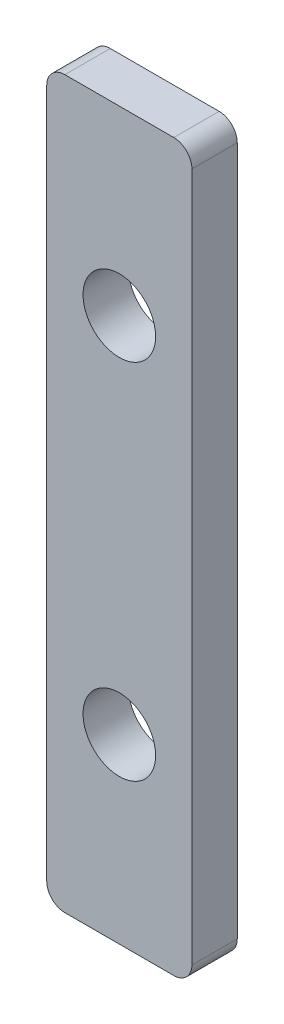
ISO-10303-21;
HEADER;
FILE_DESCRIPTION(('STEP AP214'),'2;1');
FILE_NAME('part.step','',(''),(''),'','','');
FILE_SCHEMA(('AUTOMOTIVE_DESIGN { 1 0 10303 214 1 1 1 1 }'));
ENDSEC;
DATA;
#1=APPLICATION_CONTEXT('core data for automotive mechanical design processes');
#2=APPLICATION_PROTOCOL_DEFINITION('international standard','automotive_design',2000,#1);
#3=PRODUCT_CONTEXT('',#1,'mechanical');
#4=PRODUCT('Part','Part','',(#3));
#5=PRODUCT_RELATED_PRODUCT_CATEGORY('part','',(#4));
#6=PRODUCT_DEFINITION_FORMATION('','',#4);
#7=PRODUCT_DEFINITION_CONTEXT('part definition',#1,'design');
#8=PRODUCT_DEFINITION('design','',#6,#7);
#9=PRODUCT_DEFINITION_SHAPE('','',#8);
#10=(LENGTH_UNIT() NAMED_UNIT(*) SI_UNIT(.MILLI.,.METRE.));
#11=(NAMED_UNIT(*) PLANE_ANGLE_UNIT() SI_UNIT($,.RADIAN.));
#12=(NAMED_UNIT(*) SI_UNIT($,.STERADIAN.) SOLID_ANGLE_UNIT());
#13=UNCERTAINTY_MEASURE_WITH_UNIT(LENGTH_MEASURE(1.E-05),#10,'distance_accuracy_value','');
#14=(GEOMETRIC_REPRESENTATION_CONTEXT(3) GLOBAL_UNCERTAINTY_ASSIGNED_CONTEXT((#13)) GLOBAL_UNIT_ASSIGNED_CONTEXT((#10,
#11,#12)) REPRESENTATION_CONTEXT('',''));
#15=CARTESIAN_POINT('',(0.,0.,0.));
#16=DIRECTION('',(0.,0.,1.));
#17=DIRECTION('',(1.,0.,0.));
#18=AXIS2_PLACEMENT_3D('',#15,#16,#17);
#19=CARTESIAN_POINT('',(0.,0.,2.5));
#20=DIRECTION('',(0.,0.,-1.));
#21=DIRECTION('',(-1.,0.,0.));
#22=AXIS2_PLACEMENT_3D('',#19,#20,#21);
#23=PLANE('',#22);
#24=DIRECTION('',(1.,0.,0.));
#25=VECTOR('',#24,1.);
#26=CARTESIAN_POINT('',(0.,0.,2.5));
#27=LINE('',#26,#25);
#28=CARTESIAN_POINT('',(1.,0.,2.5));
#29=VERTEX_POINT('',#28);
#30=CARTESIAN_POINT('',(7.,0.,2.5));
#31=VERTEX_POINT('',#30);
#32=EDGE_CURVE('E169',#29,#31,#27,.T.);
#33=ORIENTED_EDGE('',*,*,#32,.T.);
#34=CARTESIAN_POINT('',(7.,1.,2.5));
#35=DIRECTION('',(0.,0.,-1.));
#36=DIRECTION('',(-1.,0.,0.));
#37=AXIS2_PLACEMENT_3D('',#34,#35,#36);
#38=CIRCLE('',#37,1.);
#39=CARTESIAN_POINT('',(8.,1.,2.5));
#40=VERTEX_POINT('',#39);
#41=EDGE_CURVE('E147',#31,#40,#38,.F.);
#42=ORIENTED_EDGE('',*,*,#41,.T.);
#43=DIRECTION('',(0.,1.,0.));
#44=VECTOR('',#43,1.);
#45=CARTESIAN_POINT('',(8.,0.,2.5));
#46=LINE('',#45,#44);
#47=CARTESIAN_POINT('',(8.,39.,2.5));
#48=VERTEX_POINT('',#47);
#49=EDGE_CURVE('E117',#40,#48,#46,.T.);
#50=ORIENTED_EDGE('',*,*,#49,.T.);
#51=CARTESIAN_POINT('',(7.,39.,2.5));
#52=DIRECTION('',(0.,0.,-1.));
#53=DIRECTION('',(-1.,0.,0.));
#54=AXIS2_PLACEMENT_3D('',#51,#52,#53);
#55=CIRCLE('',#54,1.);
#56=CARTESIAN_POINT('',(7.,40.,2.5));
#57=VERTEX_POINT('',#56);
#58=EDGE_CURVE('E53',#48,#57,#55,.F.);
#59=ORIENTED_EDGE('',*,*,#58,.T.);
#60=DIRECTION('',(-1.,0.,0.));
#61=VECTOR('',#60,1.);
#62=CARTESIAN_POINT('',(0.,40.,2.5));
#63=LINE('',#62,#61);
#64=CARTESIAN_POINT('',(1.,40.,2.5));
#65=VERTEX_POINT('',#64);
#66=EDGE_CURVE('E133',#57,#65,#63,.T.);
#67=ORIENTED_EDGE('',*,*,#66,.T.);
#68=CARTESIAN_POINT('',(1.,39.,2.5));
#69=DIRECTION('',(0.,0.,-1.));
#70=DIRECTION('',(-1.,0.,0.));
#71=AXIS2_PLACEMENT_3D('',#68,#69,#70);
#72=CIRCLE('',#71,1.);
#73=CARTESIAN_POINT('',(0.,39.,2.5));
#74=VERTEX_POINT('',#73);
#75=EDGE_CURVE('E143',#65,#74,#72,.F.);
#76=ORIENTED_EDGE('',*,*,#75,.T.);
#77=DIRECTION('',(0.,-1.,0.));
#78=VECTOR('',#77,1.);
#79=CARTESIAN_POINT('',(0.,0.,2.5));
#80=LINE('',#79,#78);
#81=CARTESIAN_POINT('',(0.,1.,2.5));
#82=VERTEX_POINT('',#81);
#83=EDGE_CURVE('E127',#74,#82,#80,.T.);
#84=ORIENTED_EDGE('',*,*,#83,.T.);
#85=CARTESIAN_POINT('',(1.,1.,2.5));
#86=DIRECTION('',(0.,0.,-1.));
#87=DIRECTION('',(-1.,0.,0.));
#88=AXIS2_PLACEMENT_3D('',#85,#86,#87);
#89=CIRCLE('',#88,1.);
#90=EDGE_CURVE('E145',#82,#29,#89,.F.);
#91=ORIENTED_EDGE('',*,*,#90,.T.);
#92=EDGE_LOOP('',(#33,#42,#50,#59,#67,#76,#84,#91));
#93=FACE_BOUND('',#92,.T.);
#94=CARTESIAN_POINT('',(4.,10.,2.5));
#95=DIRECTION('',(0.,0.,1.));
#96=DIRECTION('',(1.,0.,0.));
#97=AXIS2_PLACEMENT_3D('',#94,#95,#96);
#98=CIRCLE('',#97,2.);
#99=CARTESIAN_POINT('',(6.,10.,2.5));
#100=VERTEX_POINT('',#99);
#101=EDGE_CURVE('E178',#100,#100,#98,.T.);
#102=ORIENTED_EDGE('',*,*,#101,.F.);
#103=EDGE_LOOP('',(#102));
#104=FACE_BOUND('',#103,.T.);
#105=CARTESIAN_POINT('',(4.,30.,2.5));
#106=DIRECTION('',(0.,0.,1.));
#107=DIRECTION('',(1.,0.,0.));
#108=AXIS2_PLACEMENT_3D('',#105,#106,#107);
#109=CIRCLE('',#108,2.);
#110=CARTESIAN_POINT('',(6.,30.,2.5));
#111=VERTEX_POINT('',#110);
#112=EDGE_CURVE('E183',#111,#111,#109,.T.);
#113=ORIENTED_EDGE('',*,*,#112,.F.);
#114=EDGE_LOOP('',(#113));
#115=FACE_BOUND('',#114,.T.);
#116=ADVANCED_FACE('F33',(#93,#104,#115),#23,.F.);
#117=CARTESIAN_POINT('',(0.,0.,0.));
#118=DIRECTION('',(0.,0.,-1.));
#119=DIRECTION('',(-1.,0.,0.));
#120=AXIS2_PLACEMENT_3D('',#117,#118,#119);
#121=PLANE('',#120);
#122=CARTESIAN_POINT('',(4.,10.,0.));
#123=DIRECTION('',(0.,0.,1.));
#124=DIRECTION('',(1.,0.,0.));
#125=AXIS2_PLACEMENT_3D('',#122,#123,#124);
#126=CIRCLE('',#125,2.);
#127=CARTESIAN_POINT('',(6.,10.,0.));
#128=VERTEX_POINT('',#127);
#129=EDGE_CURVE('E174',#128,#128,#126,.T.);
#130=ORIENTED_EDGE('',*,*,#129,.T.);
#131=EDGE_LOOP('',(#130));
#132=FACE_BOUND('',#131,.T.);
#133=DIRECTION('',(0.,1.,0.));
#134=VECTOR('',#133,1.);
#135=CARTESIAN_POINT('',(8.,0.,0.));
#136=LINE('',#135,#134);
#137=CARTESIAN_POINT('',(8.,1.,0.));
#138=VERTEX_POINT('',#137);
#139=CARTESIAN_POINT('',(8.,39.,0.));
#140=VERTEX_POINT('',#139);
#141=EDGE_CURVE('E115',#138,#140,#136,.T.);
#142=ORIENTED_EDGE('',*,*,#141,.F.);
#143=CARTESIAN_POINT('',(7.,1.,0.));
#144=DIRECTION('',(0.,0.,-1.));
#145=DIRECTION('',(-1.,0.,0.));
#146=AXIS2_PLACEMENT_3D('',#143,#144,#145);
#147=CIRCLE('',#146,1.);
#148=CARTESIAN_POINT('',(7.,0.,0.));
#149=VERTEX_POINT('',#148);
#150=EDGE_CURVE('E98',#138,#149,#147,.T.);
#151=ORIENTED_EDGE('',*,*,#150,.T.);
#152=DIRECTION('',(1.,0.,0.));
#153=VECTOR('',#152,1.);
#154=CARTESIAN_POINT('',(0.,0.,0.));
#155=LINE('',#154,#153);
#156=CARTESIAN_POINT('',(1.,0.,0.));
#157=VERTEX_POINT('',#156);
#158=EDGE_CURVE('E125',#157,#149,#155,.T.);
#159=ORIENTED_EDGE('',*,*,#158,.F.);
#160=CARTESIAN_POINT('',(1.,1.,0.));
#161=DIRECTION('',(0.,0.,-1.));
#162=DIRECTION('',(-1.,0.,0.));
#163=AXIS2_PLACEMENT_3D('',#160,#161,#162);
#164=CIRCLE('',#163,1.);
#165=CARTESIAN_POINT('',(0.,1.,0.));
#166=VERTEX_POINT('',#165);
#167=EDGE_CURVE('E109',#157,#166,#164,.T.);
#168=ORIENTED_EDGE('',*,*,#167,.T.);
#169=DIRECTION('',(0.,-1.,0.));
#170=VECTOR('',#169,1.);
#171=CARTESIAN_POINT('',(0.,0.,0.));
#172=LINE('',#171,#170);
#173=CARTESIAN_POINT('',(0.,39.,0.));
#174=VERTEX_POINT('',#173);
#175=EDGE_CURVE('E129',#174,#166,#172,.T.);
#176=ORIENTED_EDGE('',*,*,#175,.F.);
#177=CARTESIAN_POINT('',(1.,39.,0.));
#178=DIRECTION('',(0.,0.,-1.));
#179=DIRECTION('',(-1.,0.,0.));
#180=AXIS2_PLACEMENT_3D('',#177,#178,#179);
#181=CIRCLE('',#180,1.);
#182=CARTESIAN_POINT('',(1.,40.,0.));
#183=VERTEX_POINT('',#182);
#184=EDGE_CURVE('E136',#174,#183,#181,.T.);
#185=ORIENTED_EDGE('',*,*,#184,.T.);
#186=DIRECTION('',(-1.,0.,0.));
#187=VECTOR('',#186,1.);
#188=CARTESIAN_POINT('',(0.,40.,0.));
#189=LINE('',#188,#187);
#190=CARTESIAN_POINT('',(7.,40.,0.));
#191=VERTEX_POINT('',#190);
#192=EDGE_CURVE('E124',#191,#183,#189,.T.);
#193=ORIENTED_EDGE('',*,*,#192,.F.);
#194=CARTESIAN_POINT('',(7.,39.,0.));
#195=DIRECTION('',(0.,0.,-1.));
#196=DIRECTION('',(-1.,0.,0.));
#197=AXIS2_PLACEMENT_3D('',#194,#195,#196);
#198=CIRCLE('',#197,1.);
#199=EDGE_CURVE('E118',#191,#140,#198,.T.);
#200=ORIENTED_EDGE('',*,*,#199,.T.);
#201=EDGE_LOOP('',(#142,#151,#159,#168,#176,#185,#193,#200));
#202=FACE_BOUND('',#201,.T.);
#203=CARTESIAN_POINT('',(4.,30.,0.));
#204=DIRECTION('',(0.,0.,1.));
#205=DIRECTION('',(1.,0.,0.));
#206=AXIS2_PLACEMENT_3D('',#203,#204,#205);
#207=CIRCLE('',#206,2.);
#208=CARTESIAN_POINT('',(6.,30.,0.));
#209=VERTEX_POINT('',#208);
#210=EDGE_CURVE('E185',#209,#209,#207,.T.);
#211=ORIENTED_EDGE('',*,*,#210,.T.);
#212=EDGE_LOOP('',(#211));
#213=FACE_BOUND('',#212,.T.);
#214=ADVANCED_FACE('F121',(#132,#202,#213),#121,.T.);
#215=CARTESIAN_POINT('',(0.,0.,2.5));
#216=DIRECTION('',(1.,0.,0.));
#217=DIRECTION('',(0.,0.,-1.));
#218=AXIS2_PLACEMENT_3D('',#215,#216,#217);
#219=PLANE('',#218);
#220=ORIENTED_EDGE('',*,*,#175,.T.);
#221=DIRECTION('',(0.,0.,-1.));
#222=VECTOR('',#221,1.);
#223=CARTESIAN_POINT('',(0.,1.,2.5));
#224=LINE('',#223,#222);
#225=EDGE_CURVE('E152',#166,#82,#224,.F.);
#226=ORIENTED_EDGE('',*,*,#225,.T.);
#227=ORIENTED_EDGE('',*,*,#83,.F.);
#228=DIRECTION('',(0.,0.,-1.));
#229=VECTOR('',#228,1.);
#230=CARTESIAN_POINT('',(0.,39.,2.5));
#231=LINE('',#230,#229);
#232=EDGE_CURVE('E149',#74,#174,#231,.T.);
#233=ORIENTED_EDGE('',*,*,#232,.T.);
#234=EDGE_LOOP('',(#220,#226,#227,#233));
#235=FACE_BOUND('',#234,.T.);
#236=ADVANCED_FACE('F165',(#235),#219,.F.);
#237=CARTESIAN_POINT('',(0.,0.,2.5));
#238=DIRECTION('',(0.,1.,0.));
#239=DIRECTION('',(0.,0.,1.));
#240=AXIS2_PLACEMENT_3D('',#237,#238,#239);
#241=PLANE('',#240);
#242=ORIENTED_EDGE('',*,*,#158,.T.);
#243=DIRECTION('',(0.,0.,-1.));
#244=VECTOR('',#243,1.);
#245=CARTESIAN_POINT('',(7.,0.,2.5));
#246=LINE('',#245,#244);
#247=EDGE_CURVE('E103',#149,#31,#246,.F.);
#248=ORIENTED_EDGE('',*,*,#247,.T.);
#249=ORIENTED_EDGE('',*,*,#32,.F.);
#250=DIRECTION('',(0.,0.,-1.));
#251=VECTOR('',#250,1.);
#252=CARTESIAN_POINT('',(1.,0.,2.5));
#253=LINE('',#252,#251);
#254=EDGE_CURVE('E108',#29,#157,#253,.T.);
#255=ORIENTED_EDGE('',*,*,#254,.T.);
#256=EDGE_LOOP('',(#242,#248,#249,#255));
#257=FACE_BOUND('',#256,.T.);
#258=ADVANCED_FACE('F210',(#257),#241,.F.);
#259=CARTESIAN_POINT('',(8.,0.,2.5));
#260=DIRECTION('',(-1.,0.,0.));
#261=DIRECTION('',(0.,0.,1.));
#262=AXIS2_PLACEMENT_3D('',#259,#260,#261);
#263=PLANE('',#262);
#264=ORIENTED_EDGE('',*,*,#49,.F.);
#265=DIRECTION('',(0.,0.,-1.));
#266=VECTOR('',#265,1.);
#267=CARTESIAN_POINT('',(8.,1.,2.5));
#268=LINE('',#267,#266);
#269=EDGE_CURVE('E102',#40,#138,#268,.T.);
#270=ORIENTED_EDGE('',*,*,#269,.T.);
#271=ORIENTED_EDGE('',*,*,#141,.T.);
#272=DIRECTION('',(0.,0.,-1.));
#273=VECTOR('',#272,1.);
#274=CARTESIAN_POINT('',(8.,39.,2.5));
#275=LINE('',#274,#273);
#276=EDGE_CURVE('E119',#140,#48,#275,.F.);
#277=ORIENTED_EDGE('',*,*,#276,.T.);
#278=EDGE_LOOP('',(#264,#270,#271,#277));
#279=FACE_BOUND('',#278,.T.);
#280=ADVANCED_FACE('F114',(#279),#263,.F.);
#281=CARTESIAN_POINT('',(0.,40.,2.5));
#282=DIRECTION('',(0.,-1.,0.));
#283=DIRECTION('',(0.,0.,-1.));
#284=AXIS2_PLACEMENT_3D('',#281,#282,#283);
#285=PLANE('',#284);
#286=ORIENTED_EDGE('',*,*,#192,.T.);
#287=DIRECTION('',(0.,0.,-1.));
#288=VECTOR('',#287,1.);
#289=CARTESIAN_POINT('',(1.,40.,2.5));
#290=LINE('',#289,#288);
#291=EDGE_CURVE('E11',#183,#65,#290,.F.);
#292=ORIENTED_EDGE('',*,*,#291,.T.);
#293=ORIENTED_EDGE('',*,*,#66,.F.);
#294=DIRECTION('',(0.,0.,-1.));
#295=VECTOR('',#294,1.);
#296=CARTESIAN_POINT('',(7.,40.,2.5));
#297=LINE('',#296,#295);
#298=EDGE_CURVE('E41',#57,#191,#297,.T.);
#299=ORIENTED_EDGE('',*,*,#298,.T.);
#300=EDGE_LOOP('',(#286,#292,#293,#299));
#301=FACE_BOUND('',#300,.T.);
#302=ADVANCED_FACE('F155',(#301),#285,.F.);
#303=CARTESIAN_POINT('',(4.,10.,2.5));
#304=DIRECTION('',(0.,0.,-1.));
#305=DIRECTION('',(-1.,0.,0.));
#306=AXIS2_PLACEMENT_3D('',#303,#304,#305);
#307=CYLINDRICAL_SURFACE('',#306,2.);
#308=ORIENTED_EDGE('',*,*,#101,.T.);
#309=EDGE_LOOP('',(#308));
#310=FACE_BOUND('',#309,.T.);
#311=ORIENTED_EDGE('',*,*,#129,.F.);
#312=EDGE_LOOP('',(#311));
#313=FACE_BOUND('',#312,.T.);
#314=ADVANCED_FACE('F203',(#310,#313),#307,.F.);
#315=CARTESIAN_POINT('',(4.,30.,2.5));
#316=DIRECTION('',(0.,0.,-1.));
#317=DIRECTION('',(-1.,0.,0.));
#318=AXIS2_PLACEMENT_3D('',#315,#316,#317);
#319=CYLINDRICAL_SURFACE('',#318,2.);
#320=ORIENTED_EDGE('',*,*,#112,.T.);
#321=EDGE_LOOP('',(#320));
#322=FACE_BOUND('',#321,.T.);
#323=ORIENTED_EDGE('',*,*,#210,.F.);
#324=EDGE_LOOP('',(#323));
#325=FACE_BOUND('',#324,.T.);
#326=ADVANCED_FACE('F191',(#322,#325),#319,.F.);
#327=CARTESIAN_POINT('',(7.,1.,2.5));
#328=DIRECTION('',(0.,0.,-1.));
#329=DIRECTION('',(-1.,0.,0.));
#330=AXIS2_PLACEMENT_3D('',#327,#328,#329);
#331=CYLINDRICAL_SURFACE('',#330,1.);
#332=ORIENTED_EDGE('',*,*,#41,.F.);
#333=ORIENTED_EDGE('',*,*,#247,.F.);
#334=ORIENTED_EDGE('',*,*,#150,.F.);
#335=ORIENTED_EDGE('',*,*,#269,.F.);
#336=EDGE_LOOP('',(#332,#333,#334,#335));
#337=FACE_BOUND('',#336,.T.);
#338=ADVANCED_FACE('F101',(#337),#331,.T.);
#339=CARTESIAN_POINT('',(1.,1.,2.5));
#340=DIRECTION('',(0.,0.,-1.));
#341=DIRECTION('',(-1.,0.,0.));
#342=AXIS2_PLACEMENT_3D('',#339,#340,#341);
#343=CYLINDRICAL_SURFACE('',#342,1.);
#344=ORIENTED_EDGE('',*,*,#90,.F.);
#345=ORIENTED_EDGE('',*,*,#225,.F.);
#346=ORIENTED_EDGE('',*,*,#167,.F.);
#347=ORIENTED_EDGE('',*,*,#254,.F.);
#348=EDGE_LOOP('',(#344,#345,#346,#347));
#349=FACE_BOUND('',#348,.T.);
#350=ADVANCED_FACE('F218',(#349),#343,.T.);
#351=CARTESIAN_POINT('',(1.,39.,2.5));
#352=DIRECTION('',(0.,0.,-1.));
#353=DIRECTION('',(-1.,0.,0.));
#354=AXIS2_PLACEMENT_3D('',#351,#352,#353);
#355=CYLINDRICAL_SURFACE('',#354,1.);
#356=ORIENTED_EDGE('',*,*,#75,.F.);
#357=ORIENTED_EDGE('',*,*,#291,.F.);
#358=ORIENTED_EDGE('',*,*,#184,.F.);
#359=ORIENTED_EDGE('',*,*,#232,.F.);
#360=EDGE_LOOP('',(#356,#357,#358,#359));
#361=FACE_BOUND('',#360,.T.);
#362=ADVANCED_FACE('F162',(#361),#355,.T.);
#363=CARTESIAN_POINT('',(7.,39.,2.5));
#364=DIRECTION('',(0.,0.,-1.));
#365=DIRECTION('',(-1.,0.,0.));
#366=AXIS2_PLACEMENT_3D('',#363,#364,#365);
#367=CYLINDRICAL_SURFACE('',#366,1.);
#368=ORIENTED_EDGE('',*,*,#58,.F.);
#369=ORIENTED_EDGE('',*,*,#276,.F.);
#370=ORIENTED_EDGE('',*,*,#199,.F.);
#371=ORIENTED_EDGE('',*,*,#298,.F.);
#372=EDGE_LOOP('',(#368,#369,#370,#371));
#373=FACE_BOUND('',#372,.T.);
#374=ADVANCED_FACE('F35',(#373),#367,.T.);
#375=CLOSED_SHELL('',(#116,#214,#236,#258,#280,#302,#314,#326,#338,#350,#362,#374));
#376=MANIFOLD_SOLID_BREP('B2',#375);
#377=ADVANCED_BREP_SHAPE_REPRESENTATION('',(#18,#376),#14);
#378=SHAPE_DEFINITION_REPRESENTATION(#9,#377);
ENDSEC;
END-ISO-10303-21;
